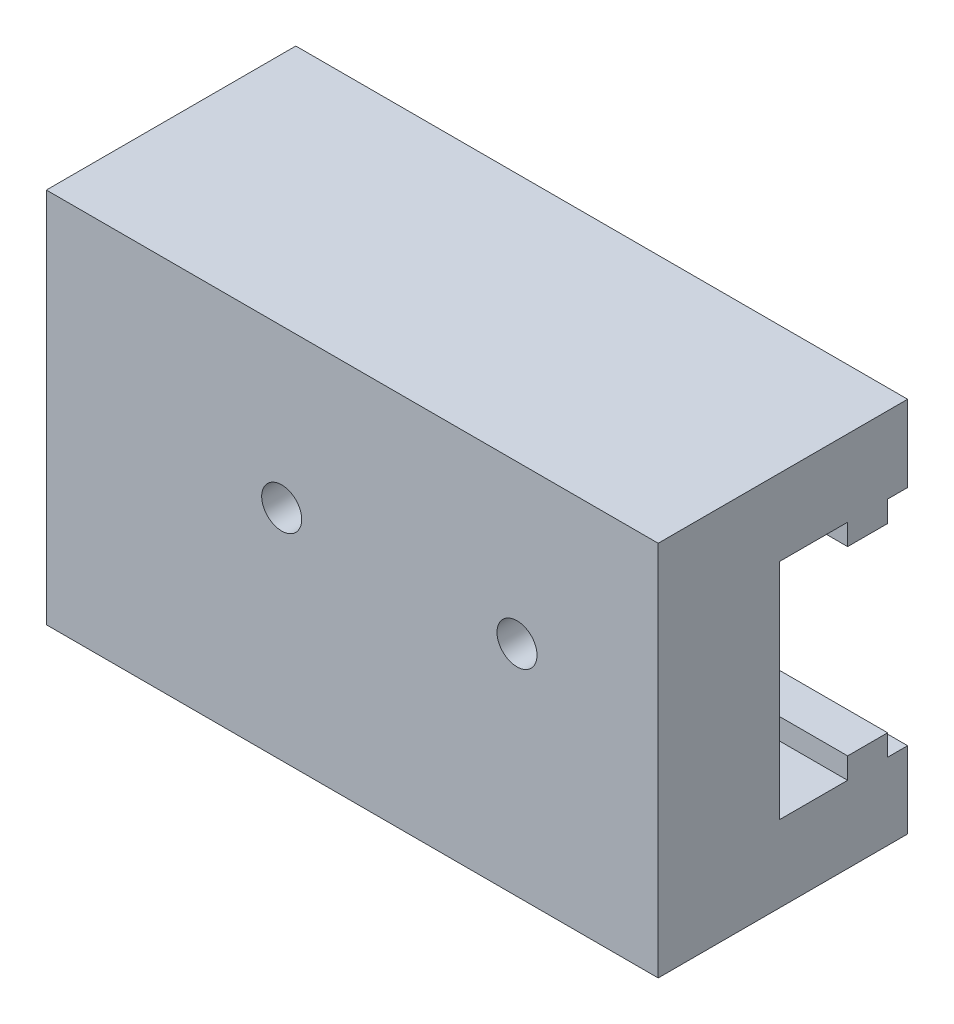
ISO-10303-21;
HEADER;
FILE_DESCRIPTION(('STEP AP214'),'2;1');
FILE_NAME('part.step','',(''),(''),'','','');
FILE_SCHEMA(('AUTOMOTIVE_DESIGN { 1 0 10303 214 1 1 1 1 }'));
ENDSEC;
DATA;
#1=APPLICATION_CONTEXT('core data for automotive mechanical design processes');
#2=APPLICATION_PROTOCOL_DEFINITION('international standard','automotive_design',2000,#1);
#3=PRODUCT_CONTEXT('',#1,'mechanical');
#4=PRODUCT('Part','Part','',(#3));
#5=PRODUCT_RELATED_PRODUCT_CATEGORY('part','',(#4));
#6=PRODUCT_DEFINITION_FORMATION('','',#4);
#7=PRODUCT_DEFINITION_CONTEXT('part definition',#1,'design');
#8=PRODUCT_DEFINITION('design','',#6,#7);
#9=PRODUCT_DEFINITION_SHAPE('','',#8);
#10=(LENGTH_UNIT() NAMED_UNIT(*) SI_UNIT(.MILLI.,.METRE.));
#11=(NAMED_UNIT(*) PLANE_ANGLE_UNIT() SI_UNIT($,.RADIAN.));
#12=(NAMED_UNIT(*) SI_UNIT($,.STERADIAN.) SOLID_ANGLE_UNIT());
#13=UNCERTAINTY_MEASURE_WITH_UNIT(LENGTH_MEASURE(1.E-05),#10,'distance_accuracy_value','');
#14=(GEOMETRIC_REPRESENTATION_CONTEXT(3) GLOBAL_UNCERTAINTY_ASSIGNED_CONTEXT((#13)) GLOBAL_UNIT_ASSIGNED_CONTEXT((#10,
#11,#12)) REPRESENTATION_CONTEXT('',''));
#15=CARTESIAN_POINT('',(0.,0.,0.));
#16=DIRECTION('',(0.,0.,1.));
#17=DIRECTION('',(1.,0.,0.));
#18=AXIS2_PLACEMENT_3D('',#15,#16,#17);
#19=CARTESIAN_POINT('',(-5.1,13.75,35.25));
#20=DIRECTION('',(0.,1.,0.));
#21=DIRECTION('',(0.,0.,1.));
#22=AXIS2_PLACEMENT_3D('',#19,#20,#21);
#23=PLANE('',#22);
#24=DIRECTION('',(0.,0.,1.));
#25=VECTOR('',#24,1.);
#26=CARTESIAN_POINT('',(-5.,13.75,40.4));
#27=LINE('',#26,#25);
#28=CARTESIAN_POINT('',(-5.,13.75,29.8));
#29=VERTEX_POINT('',#28);
#30=CARTESIAN_POINT('',(-5.,13.75,30.65));
#31=VERTEX_POINT('',#30);
#32=EDGE_CURVE('E250',#29,#31,#27,.T.);
#33=ORIENTED_EDGE('',*,*,#32,.T.);
#34=DIRECTION('',(1.,0.,0.));
#35=VECTOR('',#34,1.);
#36=CARTESIAN_POINT('',(-5.1,13.75,30.65));
#37=LINE('',#36,#35);
#38=CARTESIAN_POINT('',(21.,13.75,30.65));
#39=VERTEX_POINT('',#38);
#40=EDGE_CURVE('E54',#31,#39,#37,.T.);
#41=ORIENTED_EDGE('',*,*,#40,.T.);
#42=DIRECTION('',(0.,0.,-1.));
#43=VECTOR('',#42,1.);
#44=CARTESIAN_POINT('',(21.,13.75,40.4));
#45=LINE('',#44,#43);
#46=CARTESIAN_POINT('',(21.,13.75,29.8));
#47=VERTEX_POINT('',#46);
#48=EDGE_CURVE('E244',#39,#47,#45,.T.);
#49=ORIENTED_EDGE('',*,*,#48,.T.);
#50=DIRECTION('',(-1.,0.,0.));
#51=VECTOR('',#50,1.);
#52=CARTESIAN_POINT('',(0.,13.75,29.8));
#53=LINE('',#52,#51);
#54=EDGE_CURVE('E301',#47,#29,#53,.T.);
#55=ORIENTED_EDGE('',*,*,#54,.T.);
#56=EDGE_LOOP('',(#33,#41,#49,#55));
#57=FACE_BOUND('',#56,.T.);
#58=ADVANCED_FACE('F44',(#57),#23,.T.);
#59=CARTESIAN_POINT('',(21.1,23.25,35.25));
#60=DIRECTION('',(0.,-1.,0.));
#61=DIRECTION('',(0.,0.,-1.));
#62=AXIS2_PLACEMENT_3D('',#59,#60,#61);
#63=PLANE('',#62);
#64=DIRECTION('',(0.,0.,1.));
#65=VECTOR('',#64,1.);
#66=CARTESIAN_POINT('',(21.,23.25,40.4));
#67=LINE('',#66,#65);
#68=CARTESIAN_POINT('',(21.,23.25,29.8));
#69=VERTEX_POINT('',#68);
#70=CARTESIAN_POINT('',(21.,23.25,30.65));
#71=VERTEX_POINT('',#70);
#72=EDGE_CURVE('E231',#69,#71,#67,.T.);
#73=ORIENTED_EDGE('',*,*,#72,.T.);
#74=DIRECTION('',(-1.,0.,0.));
#75=VECTOR('',#74,1.);
#76=CARTESIAN_POINT('',(21.1,23.25,30.65));
#77=LINE('',#76,#75);
#78=CARTESIAN_POINT('',(-5.,23.25,30.65));
#79=VERTEX_POINT('',#78);
#80=EDGE_CURVE('E309',#71,#79,#77,.T.);
#81=ORIENTED_EDGE('',*,*,#80,.T.);
#82=DIRECTION('',(0.,0.,-1.));
#83=VECTOR('',#82,1.);
#84=CARTESIAN_POINT('',(-5.,23.25,40.4));
#85=LINE('',#84,#83);
#86=CARTESIAN_POINT('',(-5.,23.25,29.8));
#87=VERTEX_POINT('',#86);
#88=EDGE_CURVE('E240',#79,#87,#85,.T.);
#89=ORIENTED_EDGE('',*,*,#88,.T.);
#90=DIRECTION('',(1.,0.,0.));
#91=VECTOR('',#90,1.);
#92=CARTESIAN_POINT('',(0.,23.25,29.8));
#93=LINE('',#92,#91);
#94=EDGE_CURVE('E296',#87,#69,#93,.T.);
#95=ORIENTED_EDGE('',*,*,#94,.T.);
#96=EDGE_LOOP('',(#73,#81,#89,#95));
#97=FACE_BOUND('',#96,.T.);
#98=ADVANCED_FACE('F369',(#97),#63,.T.);
#99=CARTESIAN_POINT('',(-5.,26.5,40.4));
#100=DIRECTION('',(1.,0.,0.));
#101=DIRECTION('',(0.,0.,-1.));
#102=AXIS2_PLACEMENT_3D('',#99,#100,#101);
#103=PLANE('',#102);
#104=ORIENTED_EDGE('',*,*,#88,.F.);
#105=DIRECTION('',(0.,-1.,0.));
#106=VECTOR('',#105,1.);
#107=CARTESIAN_POINT('',(-5.,23.35,30.65));
#108=LINE('',#107,#106);
#109=CARTESIAN_POINT('',(-5.,22.35,30.65));
#110=VERTEX_POINT('',#109);
#111=EDGE_CURVE('E72',#79,#110,#108,.T.);
#112=ORIENTED_EDGE('',*,*,#111,.T.);
#113=DIRECTION('',(0.,0.,-1.));
#114=VECTOR('',#113,1.);
#115=CARTESIAN_POINT('',(-5.,22.35,32.35));
#116=LINE('',#115,#114);
#117=CARTESIAN_POINT('',(-5.,22.35,32.35));
#118=VERTEX_POINT('',#117);
#119=EDGE_CURVE('E200',#118,#110,#116,.T.);
#120=ORIENTED_EDGE('',*,*,#119,.F.);
#121=DIRECTION('',(0.,-1.,0.));
#122=VECTOR('',#121,1.);
#123=CARTESIAN_POINT('',(-5.,23.35,32.35));
#124=LINE('',#123,#122);
#125=CARTESIAN_POINT('',(-5.,23.25,32.35));
#126=VERTEX_POINT('',#125);
#127=EDGE_CURVE('E213',#126,#118,#124,.T.);
#128=ORIENTED_EDGE('',*,*,#127,.F.);
#129=CARTESIAN_POINT('',(-4.99999999999999,23.25,35.25));
#130=VERTEX_POINT('',#129);
#131=EDGE_CURVE('E236',#130,#126,#85,.T.);
#132=ORIENTED_EDGE('',*,*,#131,.F.);
#133=DIRECTION('',(0.,-1.,0.));
#134=VECTOR('',#133,1.);
#135=CARTESIAN_POINT('',(-5.,26.5,35.25));
#136=LINE('',#135,#134);
#137=CARTESIAN_POINT('',(-5.,13.75,35.25));
#138=VERTEX_POINT('',#137);
#139=EDGE_CURVE('E253',#130,#138,#136,.T.);
#140=ORIENTED_EDGE('',*,*,#139,.T.);
#141=CARTESIAN_POINT('',(-5.,13.75,32.35));
#142=VERTEX_POINT('',#141);
#143=EDGE_CURVE('E248',#142,#138,#27,.T.);
#144=ORIENTED_EDGE('',*,*,#143,.F.);
#145=DIRECTION('',(0.,-1.,0.));
#146=VECTOR('',#145,1.);
#147=CARTESIAN_POINT('',(-5.,14.65,32.35));
#148=LINE('',#147,#146);
#149=CARTESIAN_POINT('',(-5.,14.65,32.35));
#150=VERTEX_POINT('',#149);
#151=EDGE_CURVE('E168',#150,#142,#148,.T.);
#152=ORIENTED_EDGE('',*,*,#151,.F.);
#153=DIRECTION('',(0.,0.,-1.));
#154=VECTOR('',#153,1.);
#155=CARTESIAN_POINT('',(-5.,14.65,32.35));
#156=LINE('',#155,#154);
#157=CARTESIAN_POINT('',(-5.,14.65,30.65));
#158=VERTEX_POINT('',#157);
#159=EDGE_CURVE('E177',#150,#158,#156,.T.);
#160=ORIENTED_EDGE('',*,*,#159,.T.);
#161=DIRECTION('',(0.,-1.,0.));
#162=VECTOR('',#161,1.);
#163=CARTESIAN_POINT('',(-5.,14.65,30.65));
#164=LINE('',#163,#162);
#165=EDGE_CURVE('E186',#158,#31,#164,.T.);
#166=ORIENTED_EDGE('',*,*,#165,.T.);
#167=ORIENTED_EDGE('',*,*,#32,.F.);
#168=DIRECTION('',(0.,-1.,0.));
#169=VECTOR('',#168,1.);
#170=CARTESIAN_POINT('',(-5.,26.5,29.8));
#171=LINE('',#170,#169);
#172=CARTESIAN_POINT('',(-5.,10.5,29.8));
#173=VERTEX_POINT('',#172);
#174=EDGE_CURVE('E254',#29,#173,#171,.T.);
#175=ORIENTED_EDGE('',*,*,#174,.T.);
#176=DIRECTION('',(0.,0.,-1.));
#177=VECTOR('',#176,1.);
#178=CARTESIAN_POINT('',(-5.,10.5,40.4));
#179=LINE('',#178,#177);
#180=CARTESIAN_POINT('',(-5.,10.5,40.4));
#181=VERTEX_POINT('',#180);
#182=EDGE_CURVE('E298',#181,#173,#179,.T.);
#183=ORIENTED_EDGE('',*,*,#182,.F.);
#184=DIRECTION('',(0.,-1.,0.));
#185=VECTOR('',#184,1.);
#186=CARTESIAN_POINT('',(-5.,26.5,40.4));
#187=LINE('',#186,#185);
#188=CARTESIAN_POINT('',(-5.,26.5,40.4));
#189=VERTEX_POINT('',#188);
#190=EDGE_CURVE('E258',#189,#181,#187,.T.);
#191=ORIENTED_EDGE('',*,*,#190,.F.);
#192=DIRECTION('',(0.,0.,-1.));
#193=VECTOR('',#192,1.);
#194=CARTESIAN_POINT('',(-5.,26.5,40.4));
#195=LINE('',#194,#193);
#196=CARTESIAN_POINT('',(-5.,26.5,29.8));
#197=VERTEX_POINT('',#196);
#198=EDGE_CURVE('E269',#189,#197,#195,.T.);
#199=ORIENTED_EDGE('',*,*,#198,.T.);
#200=EDGE_CURVE('E271',#197,#87,#171,.T.);
#201=ORIENTED_EDGE('',*,*,#200,.T.);
#202=EDGE_LOOP('',(#104,#112,#120,#128,#132,#140,#144,#152,#160,#166,#167,#175,#183,#191,#199,#201));
#203=FACE_BOUND('',#202,.T.);
#204=ADVANCED_FACE('F50',(#203),#103,.F.);
#205=CARTESIAN_POINT('',(21.,10.5,40.4));
#206=DIRECTION('',(-1.,0.,0.));
#207=DIRECTION('',(0.,0.,1.));
#208=AXIS2_PLACEMENT_3D('',#205,#206,#207);
#209=PLANE('',#208);
#210=ORIENTED_EDGE('',*,*,#48,.F.);
#211=DIRECTION('',(0.,1.,0.));
#212=VECTOR('',#211,1.);
#213=CARTESIAN_POINT('',(21.,13.65,30.65));
#214=LINE('',#213,#212);
#215=CARTESIAN_POINT('',(21.,14.65,30.65));
#216=VERTEX_POINT('',#215);
#217=EDGE_CURVE('E62',#39,#216,#214,.T.);
#218=ORIENTED_EDGE('',*,*,#217,.T.);
#219=DIRECTION('',(0.,0.,-1.));
#220=VECTOR('',#219,1.);
#221=CARTESIAN_POINT('',(21.,14.65,32.35));
#222=LINE('',#221,#220);
#223=CARTESIAN_POINT('',(21.,14.65,32.35));
#224=VERTEX_POINT('',#223);
#225=EDGE_CURVE('E172',#224,#216,#222,.T.);
#226=ORIENTED_EDGE('',*,*,#225,.F.);
#227=DIRECTION('',(0.,1.,0.));
#228=VECTOR('',#227,1.);
#229=CARTESIAN_POINT('',(21.,13.65,32.35));
#230=LINE('',#229,#228);
#231=CARTESIAN_POINT('',(21.,13.75,32.35));
#232=VERTEX_POINT('',#231);
#233=EDGE_CURVE('E157',#232,#224,#230,.T.);
#234=ORIENTED_EDGE('',*,*,#233,.F.);
#235=CARTESIAN_POINT('',(21.,13.75,35.25));
#236=VERTEX_POINT('',#235);
#237=EDGE_CURVE('E242',#236,#232,#45,.T.);
#238=ORIENTED_EDGE('',*,*,#237,.F.);
#239=DIRECTION('',(0.,1.,0.));
#240=VECTOR('',#239,1.);
#241=CARTESIAN_POINT('',(21.,10.5,35.25));
#242=LINE('',#241,#240);
#243=CARTESIAN_POINT('',(21.,23.25,35.25));
#244=VERTEX_POINT('',#243);
#245=EDGE_CURVE('E308',#236,#244,#242,.T.);
#246=ORIENTED_EDGE('',*,*,#245,.T.);
#247=CARTESIAN_POINT('',(21.,23.25,32.35));
#248=VERTEX_POINT('',#247);
#249=EDGE_CURVE('E235',#248,#244,#67,.T.);
#250=ORIENTED_EDGE('',*,*,#249,.F.);
#251=DIRECTION('',(0.,1.,0.));
#252=VECTOR('',#251,1.);
#253=CARTESIAN_POINT('',(21.,22.35,32.35));
#254=LINE('',#253,#252);
#255=CARTESIAN_POINT('',(21.,22.35,32.35));
#256=VERTEX_POINT('',#255);
#257=EDGE_CURVE('E210',#256,#248,#254,.T.);
#258=ORIENTED_EDGE('',*,*,#257,.F.);
#259=DIRECTION('',(0.,0.,-1.));
#260=VECTOR('',#259,1.);
#261=CARTESIAN_POINT('',(21.,22.35,32.35));
#262=LINE('',#261,#260);
#263=CARTESIAN_POINT('',(21.,22.35,30.65));
#264=VERTEX_POINT('',#263);
#265=EDGE_CURVE('E201',#256,#264,#262,.T.);
#266=ORIENTED_EDGE('',*,*,#265,.T.);
#267=DIRECTION('',(0.,1.,0.));
#268=VECTOR('',#267,1.);
#269=CARTESIAN_POINT('',(21.,22.35,30.65));
#270=LINE('',#269,#268);
#271=EDGE_CURVE('E208',#264,#71,#270,.T.);
#272=ORIENTED_EDGE('',*,*,#271,.T.);
#273=ORIENTED_EDGE('',*,*,#72,.F.);
#274=DIRECTION('',(0.,1.,0.));
#275=VECTOR('',#274,1.);
#276=CARTESIAN_POINT('',(21.,10.5,29.8));
#277=LINE('',#276,#275);
#278=CARTESIAN_POINT('',(21.,26.5,29.8));
#279=VERTEX_POINT('',#278);
#280=EDGE_CURVE('E279',#69,#279,#277,.T.);
#281=ORIENTED_EDGE('',*,*,#280,.T.);
#282=DIRECTION('',(0.,0.,-1.));
#283=VECTOR('',#282,1.);
#284=CARTESIAN_POINT('',(21.,26.5,40.4));
#285=LINE('',#284,#283);
#286=CARTESIAN_POINT('',(21.,26.5,40.4));
#287=VERTEX_POINT('',#286);
#288=EDGE_CURVE('E286',#287,#279,#285,.T.);
#289=ORIENTED_EDGE('',*,*,#288,.F.);
#290=DIRECTION('',(0.,1.,0.));
#291=VECTOR('',#290,1.);
#292=CARTESIAN_POINT('',(21.,10.5,40.4));
#293=LINE('',#292,#291);
#294=CARTESIAN_POINT('',(21.,10.5,40.4));
#295=VERTEX_POINT('',#294);
#296=EDGE_CURVE('E262',#295,#287,#293,.T.);
#297=ORIENTED_EDGE('',*,*,#296,.F.);
#298=DIRECTION('',(0.,0.,-1.));
#299=VECTOR('',#298,1.);
#300=CARTESIAN_POINT('',(21.,10.5,40.4));
#301=LINE('',#300,#299);
#302=CARTESIAN_POINT('',(21.,10.5,29.8));
#303=VERTEX_POINT('',#302);
#304=EDGE_CURVE('E295',#295,#303,#301,.T.);
#305=ORIENTED_EDGE('',*,*,#304,.T.);
#306=EDGE_CURVE('E276',#303,#47,#277,.T.);
#307=ORIENTED_EDGE('',*,*,#306,.T.);
#308=EDGE_LOOP('',(#210,#218,#226,#234,#238,#246,#250,#258,#266,#272,#273,#281,#289,#297,#305,#307));
#309=FACE_BOUND('',#308,.T.);
#310=ADVANCED_FACE('F171',(#309),#209,.F.);
#311=CARTESIAN_POINT('',(0.,0.,29.8));
#312=DIRECTION('',(0.,0.,1.));
#313=DIRECTION('',(1.,0.,0.));
#314=AXIS2_PLACEMENT_3D('',#311,#312,#313);
#315=PLANE('',#314);
#316=ORIENTED_EDGE('',*,*,#54,.F.);
#317=ORIENTED_EDGE('',*,*,#306,.F.);
#318=DIRECTION('',(1.,0.,0.));
#319=VECTOR('',#318,1.);
#320=CARTESIAN_POINT('',(-5.,10.5,29.8));
#321=LINE('',#320,#319);
#322=EDGE_CURVE('E274',#173,#303,#321,.T.);
#323=ORIENTED_EDGE('',*,*,#322,.F.);
#324=ORIENTED_EDGE('',*,*,#174,.F.);
#325=EDGE_LOOP('',(#316,#317,#323,#324));
#326=FACE_BOUND('',#325,.T.);
#327=ADVANCED_FACE('F376',(#326),#315,.F.);
#328=ORIENTED_EDGE('',*,*,#94,.F.);
#329=ORIENTED_EDGE('',*,*,#200,.F.);
#330=DIRECTION('',(-1.,0.,0.));
#331=VECTOR('',#330,1.);
#332=CARTESIAN_POINT('',(21.,26.5,29.8));
#333=LINE('',#332,#331);
#334=EDGE_CURVE('E261',#279,#197,#333,.T.);
#335=ORIENTED_EDGE('',*,*,#334,.F.);
#336=ORIENTED_EDGE('',*,*,#280,.F.);
#337=EDGE_LOOP('',(#328,#329,#335,#336));
#338=FACE_BOUND('',#337,.T.);
#339=ADVANCED_FACE('F377',(#338),#315,.F.);
#340=CARTESIAN_POINT('',(-5.,10.5,40.4));
#341=DIRECTION('',(0.,1.,0.));
#342=DIRECTION('',(0.,0.,1.));
#343=AXIS2_PLACEMENT_3D('',#340,#341,#342);
#344=PLANE('',#343);
#345=ORIENTED_EDGE('',*,*,#322,.T.);
#346=ORIENTED_EDGE('',*,*,#304,.F.);
#347=DIRECTION('',(1.,0.,0.));
#348=VECTOR('',#347,1.);
#349=CARTESIAN_POINT('',(-5.,10.5,40.4));
#350=LINE('',#349,#348);
#351=EDGE_CURVE('E257',#181,#295,#350,.T.);
#352=ORIENTED_EDGE('',*,*,#351,.F.);
#353=ORIENTED_EDGE('',*,*,#182,.T.);
#354=EDGE_LOOP('',(#345,#346,#352,#353));
#355=FACE_BOUND('',#354,.T.);
#356=ADVANCED_FACE('F382',(#355),#344,.F.);
#357=CARTESIAN_POINT('',(21.,26.5,40.4));
#358=DIRECTION('',(0.,-1.,0.));
#359=DIRECTION('',(0.,0.,-1.));
#360=AXIS2_PLACEMENT_3D('',#357,#358,#359);
#361=PLANE('',#360);
#362=ORIENTED_EDGE('',*,*,#334,.T.);
#363=ORIENTED_EDGE('',*,*,#198,.F.);
#364=DIRECTION('',(-1.,0.,0.));
#365=VECTOR('',#364,1.);
#366=CARTESIAN_POINT('',(21.,26.5,40.4));
#367=LINE('',#366,#365);
#368=EDGE_CURVE('E270',#287,#189,#367,.T.);
#369=ORIENTED_EDGE('',*,*,#368,.F.);
#370=ORIENTED_EDGE('',*,*,#288,.T.);
#371=EDGE_LOOP('',(#362,#363,#369,#370));
#372=FACE_BOUND('',#371,.T.);
#373=ADVANCED_FACE('F365',(#372),#361,.F.);
#374=CARTESIAN_POINT('',(0.,0.,40.4));
#375=DIRECTION('',(0.,0.,1.));
#376=DIRECTION('',(1.,0.,0.));
#377=AXIS2_PLACEMENT_3D('',#374,#375,#376);
#378=PLANE('',#377);
#379=CARTESIAN_POINT('',(5.,19.8,40.4));
#380=DIRECTION('',(0.,0.,1.));
#381=DIRECTION('',(1.,0.,0.));
#382=AXIS2_PLACEMENT_3D('',#379,#380,#381);
#383=CIRCLE('',#382,0.85);
#384=CARTESIAN_POINT('',(5.85,19.8,40.4));
#385=VERTEX_POINT('',#384);
#386=EDGE_CURVE('E47',#385,#385,#383,.F.);
#387=ORIENTED_EDGE('',*,*,#386,.T.);
#388=EDGE_LOOP('',(#387));
#389=FACE_BOUND('',#388,.T.);
#390=CARTESIAN_POINT('',(15.,19.8,40.4));
#391=DIRECTION('',(0.,0.,1.));
#392=DIRECTION('',(1.,0.,0.));
#393=AXIS2_PLACEMENT_3D('',#390,#391,#392);
#394=CIRCLE('',#393,0.85);
#395=CARTESIAN_POINT('',(15.85,19.8,40.4));
#396=VERTEX_POINT('',#395);
#397=EDGE_CURVE('E320',#396,#396,#394,.F.);
#398=ORIENTED_EDGE('',*,*,#397,.T.);
#399=EDGE_LOOP('',(#398));
#400=FACE_BOUND('',#399,.T.);
#401=ORIENTED_EDGE('',*,*,#190,.T.);
#402=ORIENTED_EDGE('',*,*,#351,.T.);
#403=ORIENTED_EDGE('',*,*,#296,.T.);
#404=ORIENTED_EDGE('',*,*,#368,.T.);
#405=EDGE_LOOP('',(#401,#402,#403,#404));
#406=FACE_BOUND('',#405,.T.);
#407=ADVANCED_FACE('F351',(#389,#400,#406),#378,.T.);
#408=CARTESIAN_POINT('',(0.,0.,35.25));
#409=DIRECTION('',(0.,0.,1.));
#410=DIRECTION('',(1.,0.,0.));
#411=AXIS2_PLACEMENT_3D('',#408,#409,#410);
#412=PLANE('',#411);
#413=DIRECTION('',(-1.,0.,0.));
#414=VECTOR('',#413,1.);
#415=CARTESIAN_POINT('',(21.1,23.25,35.25));
#416=LINE('',#415,#414);
#417=EDGE_CURVE('E227',#244,#130,#416,.T.);
#418=ORIENTED_EDGE('',*,*,#417,.F.);
#419=ORIENTED_EDGE('',*,*,#245,.F.);
#420=DIRECTION('',(1.,0.,0.));
#421=VECTOR('',#420,1.);
#422=CARTESIAN_POINT('',(-5.1,13.75,35.25));
#423=LINE('',#422,#421);
#424=EDGE_CURVE('E176',#138,#236,#423,.T.);
#425=ORIENTED_EDGE('',*,*,#424,.F.);
#426=ORIENTED_EDGE('',*,*,#139,.F.);
#427=EDGE_LOOP('',(#418,#419,#425,#426));
#428=FACE_BOUND('',#427,.T.);
#429=ADVANCED_FACE('F352',(#428),#412,.F.);
#430=DIRECTION('',(1.,0.,0.));
#431=VECTOR('',#430,1.);
#432=CARTESIAN_POINT('',(-5.1,13.75,32.35));
#433=LINE('',#432,#431);
#434=EDGE_CURVE('E11',#142,#232,#433,.T.);
#435=ORIENTED_EDGE('',*,*,#434,.F.);
#436=ORIENTED_EDGE('',*,*,#143,.T.);
#437=ORIENTED_EDGE('',*,*,#424,.T.);
#438=ORIENTED_EDGE('',*,*,#237,.T.);
#439=EDGE_LOOP('',(#435,#436,#437,#438));
#440=FACE_BOUND('',#439,.T.);
#441=ADVANCED_FACE('F337',(#440),#23,.T.);
#442=DIRECTION('',(-1.,0.,0.));
#443=VECTOR('',#442,1.);
#444=CARTESIAN_POINT('',(21.1,23.25,32.35));
#445=LINE('',#444,#443);
#446=EDGE_CURVE('E311',#248,#126,#445,.T.);
#447=ORIENTED_EDGE('',*,*,#446,.F.);
#448=ORIENTED_EDGE('',*,*,#249,.T.);
#449=ORIENTED_EDGE('',*,*,#417,.T.);
#450=ORIENTED_EDGE('',*,*,#131,.T.);
#451=EDGE_LOOP('',(#447,#448,#449,#450));
#452=FACE_BOUND('',#451,.T.);
#453=ADVANCED_FACE('F348',(#452),#63,.T.);
#454=CARTESIAN_POINT('',(-5.,22.35,32.35));
#455=DIRECTION('',(0.,1.,0.));
#456=DIRECTION('',(0.,0.,1.));
#457=AXIS2_PLACEMENT_3D('',#454,#455,#456);
#458=PLANE('',#457);
#459=DIRECTION('',(1.,0.,0.));
#460=VECTOR('',#459,1.);
#461=CARTESIAN_POINT('',(-5.,22.35,30.65));
#462=LINE('',#461,#460);
#463=EDGE_CURVE('E215',#110,#264,#462,.T.);
#464=ORIENTED_EDGE('',*,*,#463,.T.);
#465=ORIENTED_EDGE('',*,*,#265,.F.);
#466=DIRECTION('',(1.,0.,0.));
#467=VECTOR('',#466,1.);
#468=CARTESIAN_POINT('',(-5.,22.35,32.35));
#469=LINE('',#468,#467);
#470=EDGE_CURVE('E219',#118,#256,#469,.T.);
#471=ORIENTED_EDGE('',*,*,#470,.F.);
#472=ORIENTED_EDGE('',*,*,#119,.T.);
#473=EDGE_LOOP('',(#464,#465,#471,#472));
#474=FACE_BOUND('',#473,.T.);
#475=ADVANCED_FACE('F416',(#474),#458,.F.);
#476=CARTESIAN_POINT('',(0.,0.,32.35));
#477=DIRECTION('',(0.,0.,1.));
#478=DIRECTION('',(1.,0.,0.));
#479=AXIS2_PLACEMENT_3D('',#476,#477,#478);
#480=PLANE('',#479);
#481=ORIENTED_EDGE('',*,*,#257,.T.);
#482=ORIENTED_EDGE('',*,*,#446,.T.);
#483=ORIENTED_EDGE('',*,*,#127,.T.);
#484=ORIENTED_EDGE('',*,*,#470,.T.);
#485=EDGE_LOOP('',(#481,#482,#483,#484));
#486=FACE_BOUND('',#485,.T.);
#487=ADVANCED_FACE('F423',(#486),#480,.T.);
#488=CARTESIAN_POINT('',(0.,0.,30.65));
#489=DIRECTION('',(0.,0.,1.));
#490=DIRECTION('',(1.,0.,0.));
#491=AXIS2_PLACEMENT_3D('',#488,#489,#490);
#492=PLANE('',#491);
#493=ORIENTED_EDGE('',*,*,#80,.F.);
#494=ORIENTED_EDGE('',*,*,#271,.F.);
#495=ORIENTED_EDGE('',*,*,#463,.F.);
#496=ORIENTED_EDGE('',*,*,#111,.F.);
#497=EDGE_LOOP('',(#493,#494,#495,#496));
#498=FACE_BOUND('',#497,.T.);
#499=ADVANCED_FACE('F417',(#498),#492,.F.);
#500=CARTESIAN_POINT('',(21.,14.65,32.35));
#501=DIRECTION('',(0.,-1.,0.));
#502=DIRECTION('',(0.,0.,-1.));
#503=AXIS2_PLACEMENT_3D('',#500,#501,#502);
#504=PLANE('',#503);
#505=DIRECTION('',(-1.,0.,0.));
#506=VECTOR('',#505,1.);
#507=CARTESIAN_POINT('',(21.,14.65,30.65));
#508=LINE('',#507,#506);
#509=EDGE_CURVE('E198',#216,#158,#508,.T.);
#510=ORIENTED_EDGE('',*,*,#509,.T.);
#511=ORIENTED_EDGE('',*,*,#159,.F.);
#512=DIRECTION('',(-1.,0.,0.));
#513=VECTOR('',#512,1.);
#514=CARTESIAN_POINT('',(21.,14.65,32.35));
#515=LINE('',#514,#513);
#516=EDGE_CURVE('E162',#224,#150,#515,.T.);
#517=ORIENTED_EDGE('',*,*,#516,.F.);
#518=ORIENTED_EDGE('',*,*,#225,.T.);
#519=EDGE_LOOP('',(#510,#511,#517,#518));
#520=FACE_BOUND('',#519,.T.);
#521=ADVANCED_FACE('F182',(#520),#504,.F.);
#522=CARTESIAN_POINT('',(0.,0.,32.35));
#523=DIRECTION('',(0.,0.,1.));
#524=DIRECTION('',(1.,0.,0.));
#525=AXIS2_PLACEMENT_3D('',#522,#523,#524);
#526=PLANE('',#525);
#527=ORIENTED_EDGE('',*,*,#151,.T.);
#528=ORIENTED_EDGE('',*,*,#434,.T.);
#529=ORIENTED_EDGE('',*,*,#233,.T.);
#530=ORIENTED_EDGE('',*,*,#516,.T.);
#531=EDGE_LOOP('',(#527,#528,#529,#530));
#532=FACE_BOUND('',#531,.T.);
#533=ADVANCED_FACE('F161',(#532),#526,.T.);
#534=CARTESIAN_POINT('',(0.,0.,30.65));
#535=DIRECTION('',(0.,0.,1.));
#536=DIRECTION('',(1.,0.,0.));
#537=AXIS2_PLACEMENT_3D('',#534,#535,#536);
#538=PLANE('',#537);
#539=ORIENTED_EDGE('',*,*,#40,.F.);
#540=ORIENTED_EDGE('',*,*,#165,.F.);
#541=ORIENTED_EDGE('',*,*,#509,.F.);
#542=ORIENTED_EDGE('',*,*,#217,.F.);
#543=EDGE_LOOP('',(#539,#540,#541,#542));
#544=FACE_BOUND('',#543,.T.);
#545=ADVANCED_FACE('F402',(#544),#538,.F.);
#546=CARTESIAN_POINT('',(15.,19.8,40.5));
#547=DIRECTION('',(0.,0.,-1.));
#548=DIRECTION('',(-1.,0.,0.));
#549=AXIS2_PLACEMENT_3D('',#546,#547,#548);
#550=CYLINDRICAL_SURFACE('',#549,0.85);
#551=ORIENTED_EDGE('',*,*,#397,.F.);
#552=EDGE_LOOP('',(#551));
#553=FACE_BOUND('',#552,.T.);
#554=CARTESIAN_POINT('',(15.,19.8,36.9));
#555=DIRECTION('',(0.,0.,1.));
#556=DIRECTION('',(1.,0.,0.));
#557=AXIS2_PLACEMENT_3D('',#554,#555,#556);
#558=CIRCLE('',#557,0.85);
#559=CARTESIAN_POINT('',(15.85,19.8,36.9));
#560=VERTEX_POINT('',#559);
#561=EDGE_CURVE('E330',#560,#560,#558,.T.);
#562=ORIENTED_EDGE('',*,*,#561,.F.);
#563=EDGE_LOOP('',(#562));
#564=FACE_BOUND('',#563,.T.);
#565=ADVANCED_FACE('F401',(#553,#564),#550,.F.);
#566=CARTESIAN_POINT('',(15.,19.8,36.9));
#567=DIRECTION('',(0.,0.,1.));
#568=DIRECTION('',(1.,0.,0.));
#569=AXIS2_PLACEMENT_3D('',#566,#567,#568);
#570=PLANE('',#569);
#571=ORIENTED_EDGE('',*,*,#561,.T.);
#572=EDGE_LOOP('',(#571));
#573=FACE_BOUND('',#572,.T.);
#574=ADVANCED_FACE('F410',(#573),#570,.T.);
#575=CARTESIAN_POINT('',(5.,19.8,40.5));
#576=DIRECTION('',(0.,0.,-1.));
#577=DIRECTION('',(-1.,0.,0.));
#578=AXIS2_PLACEMENT_3D('',#575,#576,#577);
#579=CYLINDRICAL_SURFACE('',#578,0.85);
#580=ORIENTED_EDGE('',*,*,#386,.F.);
#581=EDGE_LOOP('',(#580));
#582=FACE_BOUND('',#581,.T.);
#583=CARTESIAN_POINT('',(5.,19.8,36.9));
#584=DIRECTION('',(0.,0.,1.));
#585=DIRECTION('',(1.,0.,0.));
#586=AXIS2_PLACEMENT_3D('',#583,#584,#585);
#587=CIRCLE('',#586,0.85);
#588=CARTESIAN_POINT('',(5.85,19.8,36.9));
#589=VERTEX_POINT('',#588);
#590=EDGE_CURVE('E319',#589,#589,#587,.T.);
#591=ORIENTED_EDGE('',*,*,#590,.F.);
#592=EDGE_LOOP('',(#591));
#593=FACE_BOUND('',#592,.T.);
#594=ADVANCED_FACE('F485',(#582,#593),#579,.F.);
#595=CARTESIAN_POINT('',(5.,19.8,36.9));
#596=DIRECTION('',(0.,0.,1.));
#597=DIRECTION('',(1.,0.,0.));
#598=AXIS2_PLACEMENT_3D('',#595,#596,#597);
#599=PLANE('',#598);
#600=ORIENTED_EDGE('',*,*,#590,.T.);
#601=EDGE_LOOP('',(#600));
#602=FACE_BOUND('',#601,.T.);
#603=ADVANCED_FACE('F491',(#602),#599,.T.);
#604=CLOSED_SHELL('',(#58,#98,#204,#310,#327,#339,#356,#373,#407,#429,#441,#453,#475,#487,#499,
#521,#533,#545,#565,#574,#594,#603));
#605=MANIFOLD_SOLID_BREP('B2',#604);
#606=ADVANCED_BREP_SHAPE_REPRESENTATION('',(#18,#605),#14);
#607=SHAPE_DEFINITION_REPRESENTATION(#9,#606);
ENDSEC;
END-ISO-10303-21;
